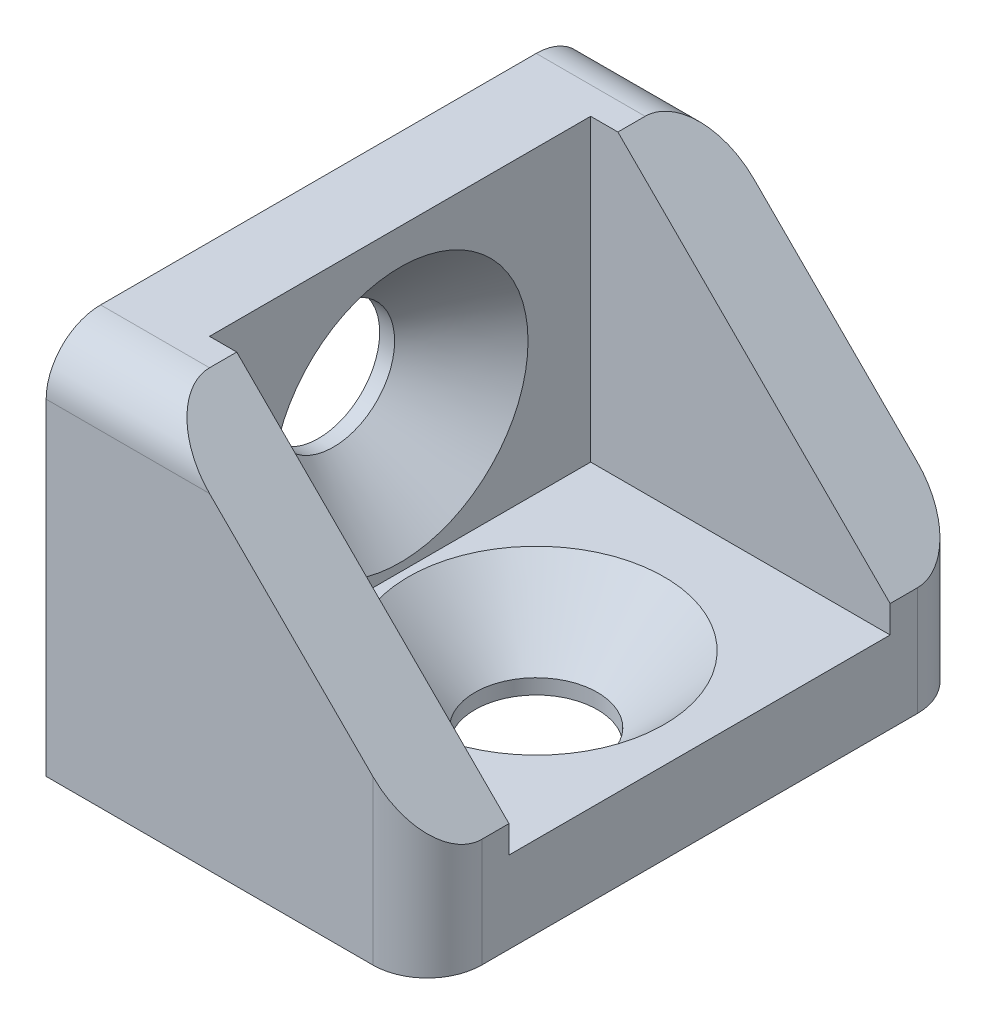
ISO-10303-21;
HEADER;
FILE_DESCRIPTION(('STEP AP214'),'2;1');
FILE_NAME('part.step','',(''),(''),'','','');
FILE_SCHEMA(('AUTOMOTIVE_DESIGN { 1 0 10303 214 1 1 1 1 }'));
ENDSEC;
DATA;
#1=APPLICATION_CONTEXT('core data for automotive mechanical design processes');
#2=APPLICATION_PROTOCOL_DEFINITION('international standard','automotive_design',2000,#1);
#3=PRODUCT_CONTEXT('',#1,'mechanical');
#4=PRODUCT('Part','Part','',(#3));
#5=PRODUCT_RELATED_PRODUCT_CATEGORY('part','',(#4));
#6=PRODUCT_DEFINITION_FORMATION('','',#4);
#7=PRODUCT_DEFINITION_CONTEXT('part definition',#1,'design');
#8=PRODUCT_DEFINITION('design','',#6,#7);
#9=PRODUCT_DEFINITION_SHAPE('','',#8);
#10=(LENGTH_UNIT() NAMED_UNIT(*) SI_UNIT(.MILLI.,.METRE.));
#11=(NAMED_UNIT(*) PLANE_ANGLE_UNIT() SI_UNIT($,.RADIAN.));
#12=(NAMED_UNIT(*) SI_UNIT($,.STERADIAN.) SOLID_ANGLE_UNIT());
#13=UNCERTAINTY_MEASURE_WITH_UNIT(LENGTH_MEASURE(1.E-05),#10,'distance_accuracy_value','');
#14=(GEOMETRIC_REPRESENTATION_CONTEXT(3) GLOBAL_UNCERTAINTY_ASSIGNED_CONTEXT((#13)) GLOBAL_UNIT_ASSIGNED_CONTEXT((#10,
#11,#12)) REPRESENTATION_CONTEXT('',''));
#15=CARTESIAN_POINT('',(0.,0.,0.));
#16=DIRECTION('',(0.,0.,1.));
#17=DIRECTION('',(1.,0.,0.));
#18=AXIS2_PLACEMENT_3D('',#15,#16,#17);
#19=CARTESIAN_POINT('',(0.,14.,-20.));
#20=DIRECTION('',(0.,1.,0.));
#21=DIRECTION('',(0.,0.,1.));
#22=AXIS2_PLACEMENT_3D('',#19,#20,#21);
#23=PLANE('',#22);
#24=DIRECTION('',(0.,0.,1.));
#25=VECTOR('',#24,1.);
#26=CARTESIAN_POINT('',(4.,14.,-20.));
#27=LINE('',#26,#25);
#28=CARTESIAN_POINT('',(4.,14.,-18.));
#29=VERTEX_POINT('',#28);
#30=CARTESIAN_POINT('',(4.,14.,-17.));
#31=VERTEX_POINT('',#30);
#32=EDGE_CURVE('E209',#29,#31,#27,.T.);
#33=ORIENTED_EDGE('',*,*,#32,.F.);
#34=DIRECTION('',(-1.,0.,0.));
#35=VECTOR('',#34,1.);
#36=CARTESIAN_POINT('',(0.,14.,-18.));
#37=LINE('',#36,#35);
#38=CARTESIAN_POINT('',(0.,14.,-18.));
#39=VERTEX_POINT('',#38);
#40=EDGE_CURVE('E216',#29,#39,#37,.T.);
#41=ORIENTED_EDGE('',*,*,#40,.T.);
#42=DIRECTION('',(0.,0.,1.));
#43=VECTOR('',#42,1.);
#44=CARTESIAN_POINT('',(0.,14.,-20.));
#45=LINE('',#44,#43);
#46=CARTESIAN_POINT('',(0.,14.,-2.));
#47=VERTEX_POINT('',#46);
#48=EDGE_CURVE('E207',#39,#47,#45,.T.);
#49=ORIENTED_EDGE('',*,*,#48,.T.);
#50=DIRECTION('',(-1.,0.,0.));
#51=VECTOR('',#50,1.);
#52=CARTESIAN_POINT('',(4.,14.,-2.));
#53=LINE('',#52,#51);
#54=CARTESIAN_POINT('',(4.,14.,-2.));
#55=VERTEX_POINT('',#54);
#56=EDGE_CURVE('E202',#47,#55,#53,.F.);
#57=ORIENTED_EDGE('',*,*,#56,.T.);
#58=CARTESIAN_POINT('',(4.,14.,-3.));
#59=VERTEX_POINT('',#58);
#60=EDGE_CURVE('E212',#59,#55,#27,.T.);
#61=ORIENTED_EDGE('',*,*,#60,.F.);
#62=DIRECTION('',(-1.,0.,0.));
#63=VECTOR('',#62,1.);
#64=CARTESIAN_POINT('',(0.,14.,-3.));
#65=LINE('',#64,#63);
#66=CARTESIAN_POINT('',(3.,14.,-3.));
#67=VERTEX_POINT('',#66);
#68=EDGE_CURVE('E180',#59,#67,#65,.T.);
#69=ORIENTED_EDGE('',*,*,#68,.T.);
#70=DIRECTION('',(0.,0.,1.));
#71=VECTOR('',#70,1.);
#72=CARTESIAN_POINT('',(3.,14.,-20.));
#73=LINE('',#72,#71);
#74=CARTESIAN_POINT('',(3.,14.,-17.));
#75=VERTEX_POINT('',#74);
#76=EDGE_CURVE('E155',#75,#67,#73,.T.);
#77=ORIENTED_EDGE('',*,*,#76,.F.);
#78=DIRECTION('',(-1.,0.,0.));
#79=VECTOR('',#78,1.);
#80=CARTESIAN_POINT('',(0.,14.,-17.));
#81=LINE('',#80,#79);
#82=EDGE_CURVE('E170',#31,#75,#81,.T.);
#83=ORIENTED_EDGE('',*,*,#82,.F.);
#84=EDGE_LOOP('',(#33,#41,#49,#57,#61,#69,#77,#83));
#85=FACE_BOUND('',#84,.T.);
#86=ADVANCED_FACE('F39',(#85),#23,.T.);
#87=CARTESIAN_POINT('',(4.,14.,-20.));
#88=DIRECTION('',(0.707106781186548,0.707106781186548,0.));
#89=DIRECTION('',(-0.707106781186548,0.707106781186548,0.));
#90=AXIS2_PLACEMENT_3D('',#87,#88,#89);
#91=PLANE('',#90);
#92=DIRECTION('',(-0.707106781186548,0.707106781186548,0.));
#93=VECTOR('',#92,1.);
#94=CARTESIAN_POINT('',(4.,14.,0.));
#95=LINE('',#94,#93);
#96=CARTESIAN_POINT('',(12.,6.,0.));
#97=VERTEX_POINT('',#96);
#98=CARTESIAN_POINT('',(6.,12.,0.));
#99=VERTEX_POINT('',#98);
#100=EDGE_CURVE('E199',#97,#99,#95,.T.);
#101=ORIENTED_EDGE('',*,*,#100,.F.);
#102=CARTESIAN_POINT('',(12.,6.,-2.));
#103=DIRECTION('',(0.707106781186548,0.707106781186548,0.));
#104=DIRECTION('',(0.707106781186548,-0.707106781186548,0.));
#105=AXIS2_PLACEMENT_3D('',#102,#103,#104);
#106=ELLIPSE('',#105,2.82842712474619,2.);
#107=CARTESIAN_POINT('',(14.,4.,-2.));
#108=VERTEX_POINT('',#107);
#109=EDGE_CURVE('E11',#97,#108,#106,.T.);
#110=ORIENTED_EDGE('',*,*,#109,.T.);
#111=DIRECTION('',(0.,0.,1.));
#112=VECTOR('',#111,1.);
#113=CARTESIAN_POINT('',(14.,4.,-20.));
#114=LINE('',#113,#112);
#115=CARTESIAN_POINT('',(14.,4.,-3.));
#116=VERTEX_POINT('',#115);
#117=EDGE_CURVE('E211',#116,#108,#114,.T.);
#118=ORIENTED_EDGE('',*,*,#117,.F.);
#119=DIRECTION('',(-0.707106781186548,0.707106781186548,0.));
#120=VECTOR('',#119,1.);
#121=CARTESIAN_POINT('',(4.,14.,-3.));
#122=LINE('',#121,#120);
#123=EDGE_CURVE('E179',#116,#59,#122,.T.);
#124=ORIENTED_EDGE('',*,*,#123,.T.);
#125=ORIENTED_EDGE('',*,*,#60,.T.);
#126=CARTESIAN_POINT('',(6.,12.,-2.));
#127=DIRECTION('',(0.707106781186548,0.707106781186548,0.));
#128=DIRECTION('',(0.707106781186548,-0.707106781186548,0.));
#129=AXIS2_PLACEMENT_3D('',#126,#127,#128);
#130=ELLIPSE('',#129,2.82842712474619,2.);
#131=EDGE_CURVE('E50',#55,#99,#130,.T.);
#132=ORIENTED_EDGE('',*,*,#131,.T.);
#133=EDGE_LOOP('',(#101,#110,#118,#124,#125,#132));
#134=FACE_BOUND('',#133,.T.);
#135=ADVANCED_FACE('F252',(#134),#91,.T.);
#136=CARTESIAN_POINT('',(14.,4.,-20.));
#137=DIRECTION('',(1.,0.,0.));
#138=DIRECTION('',(0.,0.,-1.));
#139=AXIS2_PLACEMENT_3D('',#136,#137,#138);
#140=PLANE('',#139);
#141=DIRECTION('',(0.,0.,1.));
#142=VECTOR('',#141,1.);
#143=CARTESIAN_POINT('',(14.,0.,-20.));
#144=LINE('',#143,#142);
#145=CARTESIAN_POINT('',(14.,0.,-18.));
#146=VERTEX_POINT('',#145);
#147=CARTESIAN_POINT('',(14.,0.,-2.));
#148=VERTEX_POINT('',#147);
#149=EDGE_CURVE('E198',#146,#148,#144,.T.);
#150=ORIENTED_EDGE('',*,*,#149,.F.);
#151=DIRECTION('',(0.,1.,0.));
#152=VECTOR('',#151,1.);
#153=CARTESIAN_POINT('',(14.,4.,-18.));
#154=LINE('',#153,#152);
#155=CARTESIAN_POINT('',(14.,4.,-18.));
#156=VERTEX_POINT('',#155);
#157=EDGE_CURVE('E232',#146,#156,#154,.T.);
#158=ORIENTED_EDGE('',*,*,#157,.T.);
#159=CARTESIAN_POINT('',(14.,4.,-17.));
#160=VERTEX_POINT('',#159);
#161=EDGE_CURVE('E214',#156,#160,#114,.T.);
#162=ORIENTED_EDGE('',*,*,#161,.T.);
#163=DIRECTION('',(0.,1.,0.));
#164=VECTOR('',#163,1.);
#165=CARTESIAN_POINT('',(14.,4.,-17.));
#166=LINE('',#165,#164);
#167=CARTESIAN_POINT('',(14.,3.,-17.));
#168=VERTEX_POINT('',#167);
#169=EDGE_CURVE('E162',#168,#160,#166,.T.);
#170=ORIENTED_EDGE('',*,*,#169,.F.);
#171=DIRECTION('',(0.,0.,1.));
#172=VECTOR('',#171,1.);
#173=CARTESIAN_POINT('',(14.,3.,-20.));
#174=LINE('',#173,#172);
#175=CARTESIAN_POINT('',(14.,3.,-3.));
#176=VERTEX_POINT('',#175);
#177=EDGE_CURVE('E156',#168,#176,#174,.T.);
#178=ORIENTED_EDGE('',*,*,#177,.T.);
#179=DIRECTION('',(0.,1.,0.));
#180=VECTOR('',#179,1.);
#181=CARTESIAN_POINT('',(14.,4.,-3.));
#182=LINE('',#181,#180);
#183=EDGE_CURVE('E182',#176,#116,#182,.T.);
#184=ORIENTED_EDGE('',*,*,#183,.T.);
#185=ORIENTED_EDGE('',*,*,#117,.T.);
#186=DIRECTION('',(0.,1.,0.));
#187=VECTOR('',#186,1.);
#188=CARTESIAN_POINT('',(14.,0.,-2.));
#189=LINE('',#188,#187);
#190=EDGE_CURVE('E231',#108,#148,#189,.F.);
#191=ORIENTED_EDGE('',*,*,#190,.T.);
#192=EDGE_LOOP('',(#150,#158,#162,#170,#178,#184,#185,#191));
#193=FACE_BOUND('',#192,.T.);
#194=ADVANCED_FACE('F257',(#193),#140,.T.);
#195=CARTESIAN_POINT('',(14.,0.,-20.));
#196=DIRECTION('',(0.,-1.,0.));
#197=DIRECTION('',(0.,0.,-1.));
#198=AXIS2_PLACEMENT_3D('',#195,#196,#197);
#199=PLANE('',#198);
#200=CARTESIAN_POINT('',(8.,0.,-9.99999999999999));
#201=DIRECTION('',(0.,1.,0.));
#202=DIRECTION('',(0.,0.,1.));
#203=AXIS2_PLACEMENT_3D('',#200,#201,#202);
#204=CIRCLE('',#203,2.25);
#205=CARTESIAN_POINT('',(8.,0.,-7.75));
#206=VERTEX_POINT('',#205);
#207=EDGE_CURVE('E300',#206,#206,#204,.T.);
#208=ORIENTED_EDGE('',*,*,#207,.T.);
#209=EDGE_LOOP('',(#208));
#210=FACE_BOUND('',#209,.T.);
#211=DIRECTION('',(1.,0.,0.));
#212=VECTOR('',#211,1.);
#213=CARTESIAN_POINT('',(14.,0.,-20.));
#214=LINE('',#213,#212);
#215=CARTESIAN_POINT('',(0.,0.,-20.));
#216=VERTEX_POINT('',#215);
#217=CARTESIAN_POINT('',(12.,0.,-20.));
#218=VERTEX_POINT('',#217);
#219=EDGE_CURVE('E190',#216,#218,#214,.T.);
#220=ORIENTED_EDGE('',*,*,#219,.T.);
#221=CARTESIAN_POINT('',(12.,0.,-18.));
#222=DIRECTION('',(0.,-1.,0.));
#223=DIRECTION('',(0.,0.,-1.));
#224=AXIS2_PLACEMENT_3D('',#221,#222,#223);
#225=CIRCLE('',#224,2.);
#226=EDGE_CURVE('E239',#218,#146,#225,.T.);
#227=ORIENTED_EDGE('',*,*,#226,.T.);
#228=ORIENTED_EDGE('',*,*,#149,.T.);
#229=CARTESIAN_POINT('',(12.,0.,-2.));
#230=DIRECTION('',(0.,-1.,0.));
#231=DIRECTION('',(0.,0.,-1.));
#232=AXIS2_PLACEMENT_3D('',#229,#230,#231);
#233=CIRCLE('',#232,2.);
#234=CARTESIAN_POINT('',(12.,0.,0.));
#235=VERTEX_POINT('',#234);
#236=EDGE_CURVE('E238',#148,#235,#233,.T.);
#237=ORIENTED_EDGE('',*,*,#236,.T.);
#238=DIRECTION('',(1.,0.,0.));
#239=VECTOR('',#238,1.);
#240=CARTESIAN_POINT('',(14.,0.,0.));
#241=LINE('',#240,#239);
#242=CARTESIAN_POINT('',(0.,0.,0.));
#243=VERTEX_POINT('',#242);
#244=EDGE_CURVE('E153',#243,#235,#241,.T.);
#245=ORIENTED_EDGE('',*,*,#244,.F.);
#246=DIRECTION('',(0.,0.,1.));
#247=VECTOR('',#246,1.);
#248=CARTESIAN_POINT('',(0.,0.,-20.));
#249=LINE('',#248,#247);
#250=EDGE_CURVE('E205',#216,#243,#249,.T.);
#251=ORIENTED_EDGE('',*,*,#250,.F.);
#252=EDGE_LOOP('',(#220,#227,#228,#237,#245,#251));
#253=FACE_BOUND('',#252,.T.);
#254=ADVANCED_FACE('F256',(#210,#253),#199,.T.);
#255=CARTESIAN_POINT('',(0.,0.,-20.));
#256=DIRECTION('',(-1.,0.,0.));
#257=DIRECTION('',(0.,0.,1.));
#258=AXIS2_PLACEMENT_3D('',#255,#256,#257);
#259=PLANE('',#258);
#260=CARTESIAN_POINT('',(0.,8.,-9.99999999999999));
#261=DIRECTION('',(1.,0.,0.));
#262=DIRECTION('',(0.,0.,-1.));
#263=AXIS2_PLACEMENT_3D('',#260,#261,#262);
#264=CIRCLE('',#263,2.24999999999999);
#265=CARTESIAN_POINT('',(0.,8.,-12.25));
#266=VERTEX_POINT('',#265);
#267=EDGE_CURVE('E288',#266,#266,#264,.T.);
#268=ORIENTED_EDGE('',*,*,#267,.T.);
#269=EDGE_LOOP('',(#268));
#270=FACE_BOUND('',#269,.T.);
#271=ORIENTED_EDGE('',*,*,#48,.F.);
#272=CARTESIAN_POINT('',(0.,12.,-18.));
#273=DIRECTION('',(-1.,0.,0.));
#274=DIRECTION('',(0.,0.,1.));
#275=AXIS2_PLACEMENT_3D('',#272,#273,#274);
#276=CIRCLE('',#275,2.);
#277=CARTESIAN_POINT('',(0.,12.,-20.));
#278=VERTEX_POINT('',#277);
#279=EDGE_CURVE('E221',#39,#278,#276,.T.);
#280=ORIENTED_EDGE('',*,*,#279,.T.);
#281=DIRECTION('',(0.,-1.,0.));
#282=VECTOR('',#281,1.);
#283=CARTESIAN_POINT('',(0.,0.,-20.));
#284=LINE('',#283,#282);
#285=EDGE_CURVE('E191',#278,#216,#284,.T.);
#286=ORIENTED_EDGE('',*,*,#285,.T.);
#287=ORIENTED_EDGE('',*,*,#250,.T.);
#288=DIRECTION('',(0.,-1.,0.));
#289=VECTOR('',#288,1.);
#290=CARTESIAN_POINT('',(0.,0.,0.));
#291=LINE('',#290,#289);
#292=CARTESIAN_POINT('',(0.,12.,0.));
#293=VERTEX_POINT('',#292);
#294=EDGE_CURVE('E192',#293,#243,#291,.T.);
#295=ORIENTED_EDGE('',*,*,#294,.F.);
#296=CARTESIAN_POINT('',(0.,12.,-2.));
#297=DIRECTION('',(-1.,0.,0.));
#298=DIRECTION('',(0.,0.,1.));
#299=AXIS2_PLACEMENT_3D('',#296,#297,#298);
#300=CIRCLE('',#299,2.);
#301=EDGE_CURVE('E223',#293,#47,#300,.T.);
#302=ORIENTED_EDGE('',*,*,#301,.T.);
#303=EDGE_LOOP('',(#271,#280,#286,#287,#295,#302));
#304=FACE_BOUND('',#303,.T.);
#305=ADVANCED_FACE('F329',(#270,#304),#259,.T.);
#306=DIRECTION('',(-0.707106781186548,0.707106781186548,0.));
#307=VECTOR('',#306,1.);
#308=CARTESIAN_POINT('',(4.,14.,-20.));
#309=LINE('',#308,#307);
#310=CARTESIAN_POINT('',(12.,6.,-20.));
#311=VERTEX_POINT('',#310);
#312=CARTESIAN_POINT('',(6.,12.,-20.));
#313=VERTEX_POINT('',#312);
#314=EDGE_CURVE('E188',#311,#313,#309,.T.);
#315=ORIENTED_EDGE('',*,*,#314,.T.);
#316=CARTESIAN_POINT('',(6.,12.,-18.));
#317=DIRECTION('',(0.707106781186548,0.707106781186548,0.));
#318=DIRECTION('',(-0.707106781186548,0.707106781186548,0.));
#319=AXIS2_PLACEMENT_3D('',#316,#317,#318);
#320=ELLIPSE('',#319,2.82842712474619,2.);
#321=EDGE_CURVE('E233',#313,#29,#320,.T.);
#322=ORIENTED_EDGE('',*,*,#321,.T.);
#323=ORIENTED_EDGE('',*,*,#32,.T.);
#324=DIRECTION('',(-0.707106781186548,0.707106781186548,0.));
#325=VECTOR('',#324,1.);
#326=CARTESIAN_POINT('',(4.,14.,-17.));
#327=LINE('',#326,#325);
#328=EDGE_CURVE('E167',#160,#31,#327,.T.);
#329=ORIENTED_EDGE('',*,*,#328,.F.);
#330=ORIENTED_EDGE('',*,*,#161,.F.);
#331=CARTESIAN_POINT('',(12.,6.,-18.));
#332=DIRECTION('',(0.707106781186548,0.707106781186548,0.));
#333=DIRECTION('',(-0.707106781186548,0.707106781186548,0.));
#334=AXIS2_PLACEMENT_3D('',#331,#332,#333);
#335=ELLIPSE('',#334,2.82842712474619,2.);
#336=EDGE_CURVE('E230',#156,#311,#335,.T.);
#337=ORIENTED_EDGE('',*,*,#336,.T.);
#338=EDGE_LOOP('',(#315,#322,#323,#329,#330,#337));
#339=FACE_BOUND('',#338,.T.);
#340=ADVANCED_FACE('F269',(#339),#91,.T.);
#341=CARTESIAN_POINT('',(0.,0.,-20.));
#342=DIRECTION('',(0.,0.,-1.));
#343=DIRECTION('',(-1.,0.,0.));
#344=AXIS2_PLACEMENT_3D('',#341,#342,#343);
#345=PLANE('',#344);
#346=ORIENTED_EDGE('',*,*,#285,.F.);
#347=DIRECTION('',(-1.,0.,0.));
#348=VECTOR('',#347,1.);
#349=CARTESIAN_POINT('',(0.,12.,-20.));
#350=LINE('',#349,#348);
#351=EDGE_CURVE('E227',#278,#313,#350,.F.);
#352=ORIENTED_EDGE('',*,*,#351,.T.);
#353=ORIENTED_EDGE('',*,*,#314,.F.);
#354=DIRECTION('',(0.,1.,0.));
#355=VECTOR('',#354,1.);
#356=CARTESIAN_POINT('',(12.,0.,-20.));
#357=LINE('',#356,#355);
#358=EDGE_CURVE('E222',#311,#218,#357,.F.);
#359=ORIENTED_EDGE('',*,*,#358,.T.);
#360=ORIENTED_EDGE('',*,*,#219,.F.);
#361=EDGE_LOOP('',(#346,#352,#353,#359,#360));
#362=FACE_BOUND('',#361,.T.);
#363=ADVANCED_FACE('F274',(#362),#345,.T.);
#364=CARTESIAN_POINT('',(0.,0.,0.));
#365=DIRECTION('',(0.,0.,-1.));
#366=DIRECTION('',(-1.,0.,0.));
#367=AXIS2_PLACEMENT_3D('',#364,#365,#366);
#368=PLANE('',#367);
#369=ORIENTED_EDGE('',*,*,#244,.T.);
#370=DIRECTION('',(0.,1.,0.));
#371=VECTOR('',#370,1.);
#372=CARTESIAN_POINT('',(12.,4.,0.));
#373=LINE('',#372,#371);
#374=EDGE_CURVE('E244',#235,#97,#373,.T.);
#375=ORIENTED_EDGE('',*,*,#374,.T.);
#376=ORIENTED_EDGE('',*,*,#100,.T.);
#377=DIRECTION('',(-1.,0.,0.));
#378=VECTOR('',#377,1.);
#379=CARTESIAN_POINT('',(0.,12.,0.));
#380=LINE('',#379,#378);
#381=EDGE_CURVE('E245',#99,#293,#380,.T.);
#382=ORIENTED_EDGE('',*,*,#381,.T.);
#383=ORIENTED_EDGE('',*,*,#294,.T.);
#384=EDGE_LOOP('',(#369,#375,#376,#382,#383));
#385=FACE_BOUND('',#384,.T.);
#386=ADVANCED_FACE('F250',(#385),#368,.F.);
#387=CARTESIAN_POINT('',(14.,3.,-20.));
#388=DIRECTION('',(0.,-1.,0.));
#389=DIRECTION('',(0.,0.,-1.));
#390=AXIS2_PLACEMENT_3D('',#387,#388,#389);
#391=PLANE('',#390);
#392=CARTESIAN_POINT('',(8.,3.,-9.99999999999999));
#393=DIRECTION('',(0.,1.,0.));
#394=DIRECTION('',(0.,0.,1.));
#395=AXIS2_PLACEMENT_3D('',#392,#393,#394);
#396=CIRCLE('',#395,4.7);
#397=CARTESIAN_POINT('',(8.,3.,-5.3));
#398=VERTEX_POINT('',#397);
#399=EDGE_CURVE('E303',#398,#398,#396,.T.);
#400=ORIENTED_EDGE('',*,*,#399,.F.);
#401=EDGE_LOOP('',(#400));
#402=FACE_BOUND('',#401,.T.);
#403=DIRECTION('',(1.,0.,0.));
#404=VECTOR('',#403,1.);
#405=CARTESIAN_POINT('',(14.,3.,-3.));
#406=LINE('',#405,#404);
#407=CARTESIAN_POINT('',(3.,3.,-3.));
#408=VERTEX_POINT('',#407);
#409=EDGE_CURVE('E187',#408,#176,#406,.T.);
#410=ORIENTED_EDGE('',*,*,#409,.T.);
#411=ORIENTED_EDGE('',*,*,#177,.F.);
#412=DIRECTION('',(1.,0.,0.));
#413=VECTOR('',#412,1.);
#414=CARTESIAN_POINT('',(14.,3.,-17.));
#415=LINE('',#414,#413);
#416=CARTESIAN_POINT('',(3.,3.,-17.));
#417=VERTEX_POINT('',#416);
#418=EDGE_CURVE('E152',#417,#168,#415,.T.);
#419=ORIENTED_EDGE('',*,*,#418,.F.);
#420=DIRECTION('',(0.,0.,1.));
#421=VECTOR('',#420,1.);
#422=CARTESIAN_POINT('',(3.,3.,-20.));
#423=LINE('',#422,#421);
#424=EDGE_CURVE('E137',#417,#408,#423,.T.);
#425=ORIENTED_EDGE('',*,*,#424,.T.);
#426=EDGE_LOOP('',(#410,#411,#419,#425));
#427=FACE_BOUND('',#426,.T.);
#428=ADVANCED_FACE('F158',(#402,#427),#391,.F.);
#429=CARTESIAN_POINT('',(3.,0.,-20.));
#430=DIRECTION('',(-1.,0.,0.));
#431=DIRECTION('',(0.,0.,1.));
#432=AXIS2_PLACEMENT_3D('',#429,#430,#431);
#433=PLANE('',#432);
#434=CARTESIAN_POINT('',(3.,8.,-9.99999999999999));
#435=DIRECTION('',(1.,0.,0.));
#436=DIRECTION('',(0.,0.,-1.));
#437=AXIS2_PLACEMENT_3D('',#434,#435,#436);
#438=CIRCLE('',#437,4.7);
#439=CARTESIAN_POINT('',(3.,8.,-14.7));
#440=VERTEX_POINT('',#439);
#441=EDGE_CURVE('E295',#440,#440,#438,.T.);
#442=ORIENTED_EDGE('',*,*,#441,.F.);
#443=EDGE_LOOP('',(#442));
#444=FACE_BOUND('',#443,.T.);
#445=DIRECTION('',(0.,-1.,0.));
#446=VECTOR('',#445,1.);
#447=CARTESIAN_POINT('',(3.,0.,-3.));
#448=LINE('',#447,#446);
#449=EDGE_CURVE('E149',#67,#408,#448,.T.);
#450=ORIENTED_EDGE('',*,*,#449,.T.);
#451=ORIENTED_EDGE('',*,*,#424,.F.);
#452=DIRECTION('',(0.,-1.,0.));
#453=VECTOR('',#452,1.);
#454=CARTESIAN_POINT('',(3.,0.,-17.));
#455=LINE('',#454,#453);
#456=EDGE_CURVE('E144',#75,#417,#455,.T.);
#457=ORIENTED_EDGE('',*,*,#456,.F.);
#458=ORIENTED_EDGE('',*,*,#76,.T.);
#459=EDGE_LOOP('',(#450,#451,#457,#458));
#460=FACE_BOUND('',#459,.T.);
#461=ADVANCED_FACE('F145',(#444,#460),#433,.F.);
#462=CARTESIAN_POINT('',(0.,0.,-17.));
#463=DIRECTION('',(0.,0.,-1.));
#464=DIRECTION('',(-1.,0.,0.));
#465=AXIS2_PLACEMENT_3D('',#462,#463,#464);
#466=PLANE('',#465);
#467=ORIENTED_EDGE('',*,*,#418,.T.);
#468=ORIENTED_EDGE('',*,*,#169,.T.);
#469=ORIENTED_EDGE('',*,*,#328,.T.);
#470=ORIENTED_EDGE('',*,*,#82,.T.);
#471=ORIENTED_EDGE('',*,*,#456,.T.);
#472=EDGE_LOOP('',(#467,#468,#469,#470,#471));
#473=FACE_BOUND('',#472,.T.);
#474=ADVANCED_FACE('F165',(#473),#466,.F.);
#475=CARTESIAN_POINT('',(0.,0.,-3.));
#476=DIRECTION('',(0.,0.,-1.));
#477=DIRECTION('',(-1.,0.,0.));
#478=AXIS2_PLACEMENT_3D('',#475,#476,#477);
#479=PLANE('',#478);
#480=ORIENTED_EDGE('',*,*,#409,.F.);
#481=ORIENTED_EDGE('',*,*,#449,.F.);
#482=ORIENTED_EDGE('',*,*,#68,.F.);
#483=ORIENTED_EDGE('',*,*,#123,.F.);
#484=ORIENTED_EDGE('',*,*,#183,.F.);
#485=EDGE_LOOP('',(#480,#481,#482,#483,#484));
#486=FACE_BOUND('',#485,.T.);
#487=ADVANCED_FACE('F282',(#486),#479,.T.);
#488=CARTESIAN_POINT('',(0.,12.,-18.));
#489=DIRECTION('',(-1.,0.,0.));
#490=DIRECTION('',(0.,0.,1.));
#491=AXIS2_PLACEMENT_3D('',#488,#489,#490);
#492=CYLINDRICAL_SURFACE('',#491,2.);
#493=ORIENTED_EDGE('',*,*,#321,.F.);
#494=ORIENTED_EDGE('',*,*,#351,.F.);
#495=ORIENTED_EDGE('',*,*,#279,.F.);
#496=ORIENTED_EDGE('',*,*,#40,.F.);
#497=EDGE_LOOP('',(#493,#494,#495,#496));
#498=FACE_BOUND('',#497,.T.);
#499=ADVANCED_FACE('F280',(#498),#492,.T.);
#500=CARTESIAN_POINT('',(12.,4.,-18.));
#501=DIRECTION('',(0.,1.,0.));
#502=DIRECTION('',(0.,0.,1.));
#503=AXIS2_PLACEMENT_3D('',#500,#501,#502);
#504=CYLINDRICAL_SURFACE('',#503,2.);
#505=ORIENTED_EDGE('',*,*,#226,.F.);
#506=ORIENTED_EDGE('',*,*,#358,.F.);
#507=ORIENTED_EDGE('',*,*,#336,.F.);
#508=ORIENTED_EDGE('',*,*,#157,.F.);
#509=EDGE_LOOP('',(#505,#506,#507,#508));
#510=FACE_BOUND('',#509,.T.);
#511=ADVANCED_FACE('F262',(#510),#504,.T.);
#512=CARTESIAN_POINT('',(12.,0.,-2.));
#513=DIRECTION('',(0.,-1.,0.));
#514=DIRECTION('',(0.,0.,-1.));
#515=AXIS2_PLACEMENT_3D('',#512,#513,#514);
#516=CYLINDRICAL_SURFACE('',#515,2.);
#517=ORIENTED_EDGE('',*,*,#236,.F.);
#518=ORIENTED_EDGE('',*,*,#190,.F.);
#519=ORIENTED_EDGE('',*,*,#109,.F.);
#520=ORIENTED_EDGE('',*,*,#374,.F.);
#521=EDGE_LOOP('',(#517,#518,#519,#520));
#522=FACE_BOUND('',#521,.T.);
#523=ADVANCED_FACE('F259',(#522),#516,.T.);
#524=CARTESIAN_POINT('',(0.,12.,-2.));
#525=DIRECTION('',(1.,0.,0.));
#526=DIRECTION('',(0.,0.,-1.));
#527=AXIS2_PLACEMENT_3D('',#524,#525,#526);
#528=CYLINDRICAL_SURFACE('',#527,2.);
#529=ORIENTED_EDGE('',*,*,#131,.F.);
#530=ORIENTED_EDGE('',*,*,#56,.F.);
#531=ORIENTED_EDGE('',*,*,#301,.F.);
#532=ORIENTED_EDGE('',*,*,#381,.F.);
#533=EDGE_LOOP('',(#529,#530,#531,#532));
#534=FACE_BOUND('',#533,.T.);
#535=ADVANCED_FACE('F41',(#534),#528,.T.);
#536=CARTESIAN_POINT('',(3.,8.,-9.99999999999999));
#537=DIRECTION('',(1.,0.,0.));
#538=DIRECTION('',(0.,0.,-1.));
#539=AXIS2_PLACEMENT_3D('',#536,#537,#538);
#540=CYLINDRICAL_SURFACE('',#539,2.24999999999999);
#541=ORIENTED_EDGE('',*,*,#267,.F.);
#542=EDGE_LOOP('',(#541));
#543=FACE_BOUND('',#542,.T.);
#544=CARTESIAN_POINT('',(0.55,8.,-9.99999999999999));
#545=DIRECTION('',(1.,0.,0.));
#546=DIRECTION('',(0.,0.,-1.));
#547=AXIS2_PLACEMENT_3D('',#544,#545,#546);
#548=CIRCLE('',#547,2.25);
#549=CARTESIAN_POINT('',(0.55,8.,-12.25));
#550=VERTEX_POINT('',#549);
#551=EDGE_CURVE('E289',#550,#550,#548,.T.);
#552=ORIENTED_EDGE('',*,*,#551,.T.);
#553=EDGE_LOOP('',(#552));
#554=FACE_BOUND('',#553,.T.);
#555=ADVANCED_FACE('F345',(#543,#554),#540,.F.);
#556=CARTESIAN_POINT('',(3.,8.,-9.99999999999999));
#557=DIRECTION('',(1.,0.,0.));
#558=DIRECTION('',(0.,0.,-1.));
#559=AXIS2_PLACEMENT_3D('',#556,#557,#558);
#560=CONICAL_SURFACE('',#559,4.7,0.785398163397448);
#561=ORIENTED_EDGE('',*,*,#551,.F.);
#562=EDGE_LOOP('',(#561));
#563=FACE_BOUND('',#562,.T.);
#564=ORIENTED_EDGE('',*,*,#441,.T.);
#565=EDGE_LOOP('',(#564));
#566=FACE_BOUND('',#565,.T.);
#567=ADVANCED_FACE('F349',(#563,#566),#560,.F.);
#568=CARTESIAN_POINT('',(8.,3.,-9.99999999999999));
#569=DIRECTION('',(0.,1.,0.));
#570=DIRECTION('',(0.,0.,1.));
#571=AXIS2_PLACEMENT_3D('',#568,#569,#570);
#572=CYLINDRICAL_SURFACE('',#571,2.25);
#573=ORIENTED_EDGE('',*,*,#207,.F.);
#574=EDGE_LOOP('',(#573));
#575=FACE_BOUND('',#574,.T.);
#576=CARTESIAN_POINT('',(8.,0.550000000000001,-9.99999999999999));
#577=DIRECTION('',(0.,1.,0.));
#578=DIRECTION('',(0.,0.,1.));
#579=AXIS2_PLACEMENT_3D('',#576,#577,#578);
#580=CIRCLE('',#579,2.25);
#581=CARTESIAN_POINT('',(8.,0.550000000000001,-7.74999999999999));
#582=VERTEX_POINT('',#581);
#583=EDGE_CURVE('E297',#582,#582,#580,.T.);
#584=ORIENTED_EDGE('',*,*,#583,.T.);
#585=EDGE_LOOP('',(#584));
#586=FACE_BOUND('',#585,.T.);
#587=ADVANCED_FACE('F361',(#575,#586),#572,.F.);
#588=CARTESIAN_POINT('',(8.,3.,-9.99999999999999));
#589=DIRECTION('',(0.,1.,0.));
#590=DIRECTION('',(0.,0.,1.));
#591=AXIS2_PLACEMENT_3D('',#588,#589,#590);
#592=CONICAL_SURFACE('',#591,4.7,0.785398163397448);
#593=ORIENTED_EDGE('',*,*,#583,.F.);
#594=EDGE_LOOP('',(#593));
#595=FACE_BOUND('',#594,.T.);
#596=ORIENTED_EDGE('',*,*,#399,.T.);
#597=EDGE_LOOP('',(#596));
#598=FACE_BOUND('',#597,.T.);
#599=ADVANCED_FACE('F310',(#595,#598),#592,.F.);
#600=CLOSED_SHELL('',(#86,#135,#194,#254,#305,#340,#363,#386,#428,#461,#474,#487,#499,#511,#523,
#535,#555,#567,#587,#599));
#601=MANIFOLD_SOLID_BREP('B2',#600);
#602=ADVANCED_BREP_SHAPE_REPRESENTATION('',(#18,#601),#14);
#603=SHAPE_DEFINITION_REPRESENTATION(#9,#602);
ENDSEC;
END-ISO-10303-21;
